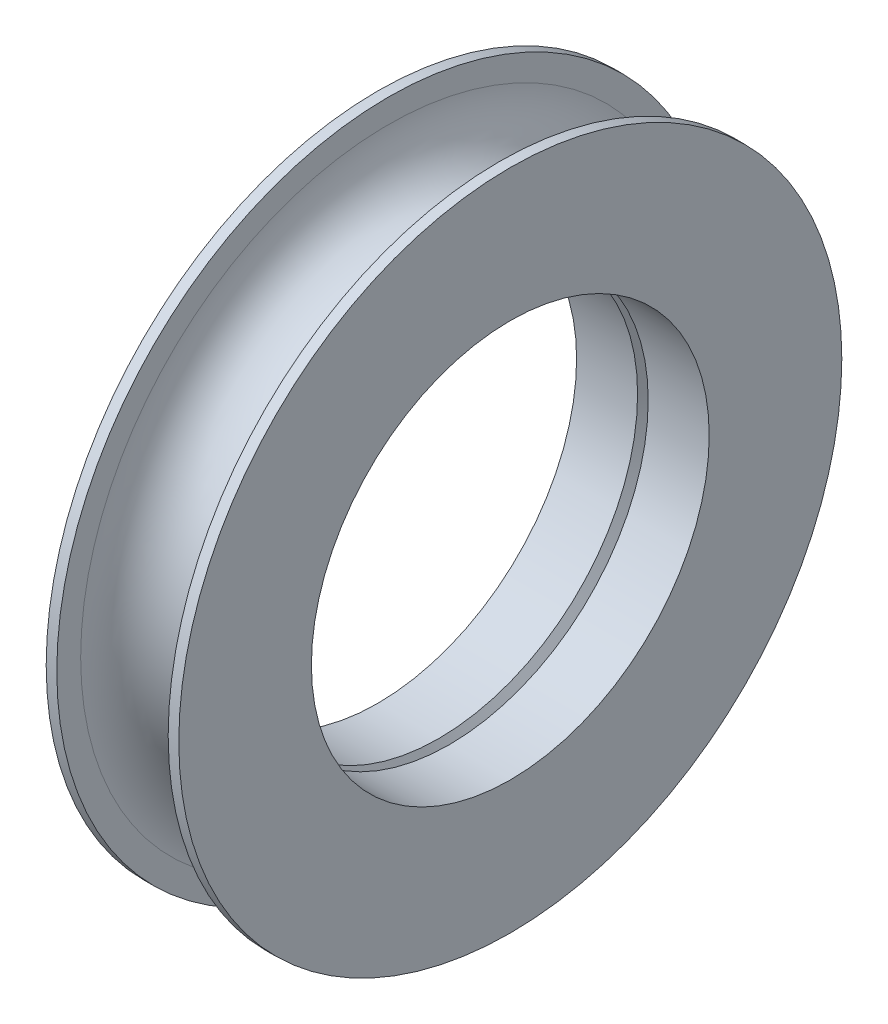
ISO-10303-21;
HEADER;
FILE_DESCRIPTION(('STEP AP214'),'2;1');
FILE_NAME('part.step','',(''),(''),'','','');
FILE_SCHEMA(('AUTOMOTIVE_DESIGN { 1 0 10303 214 1 1 1 1 }'));
ENDSEC;
DATA;
#1=APPLICATION_CONTEXT('core data for automotive mechanical design processes');
#2=APPLICATION_PROTOCOL_DEFINITION('international standard','automotive_design',2000,#1);
#3=PRODUCT_CONTEXT('',#1,'mechanical');
#4=PRODUCT('Part','Part','',(#3));
#5=PRODUCT_RELATED_PRODUCT_CATEGORY('part','',(#4));
#6=PRODUCT_DEFINITION_FORMATION('','',#4);
#7=PRODUCT_DEFINITION_CONTEXT('part definition',#1,'design');
#8=PRODUCT_DEFINITION('design','',#6,#7);
#9=PRODUCT_DEFINITION_SHAPE('','',#8);
#10=(LENGTH_UNIT() NAMED_UNIT(*) SI_UNIT(.MILLI.,.METRE.));
#11=(NAMED_UNIT(*) PLANE_ANGLE_UNIT() SI_UNIT($,.RADIAN.));
#12=(NAMED_UNIT(*) SI_UNIT($,.STERADIAN.) SOLID_ANGLE_UNIT());
#13=UNCERTAINTY_MEASURE_WITH_UNIT(LENGTH_MEASURE(1.E-05),#10,'distance_accuracy_value','');
#14=(GEOMETRIC_REPRESENTATION_CONTEXT(3) GLOBAL_UNCERTAINTY_ASSIGNED_CONTEXT((#13)) GLOBAL_UNIT_ASSIGNED_CONTEXT((#10,
#11,#12)) REPRESENTATION_CONTEXT('',''));
#15=CARTESIAN_POINT('',(0.,0.,0.));
#16=DIRECTION('',(0.,0.,1.));
#17=DIRECTION('',(1.,0.,0.));
#18=AXIS2_PLACEMENT_3D('',#15,#16,#17);
#19=CARTESIAN_POINT('',(-2.5,7.5,0.));
#20=DIRECTION('',(1.,0.,0.));
#21=DIRECTION('',(0.,0.,-1.));
#22=AXIS2_PLACEMENT_3D('',#19,#20,#21);
#23=PLANE('',#22);
#24=CARTESIAN_POINT('',(-2.5,0.,0.));
#25=DIRECTION('',(-1.,0.,0.));
#26=DIRECTION('',(0.,0.,1.));
#27=AXIS2_PLACEMENT_3D('',#24,#25,#26);
#28=CIRCLE('',#27,7.5);
#29=CARTESIAN_POINT('',(-2.5,0.,7.5));
#30=VERTEX_POINT('',#29);
#31=EDGE_CURVE('E10',#30,#30,#28,.T.);
#32=ORIENTED_EDGE('',*,*,#31,.F.);
#33=EDGE_LOOP('',(#32));
#34=FACE_BOUND('',#33,.T.);
#35=CARTESIAN_POINT('',(-2.5,0.,0.));
#36=DIRECTION('',(-1.,0.,0.));
#37=DIRECTION('',(0.,0.,1.));
#38=AXIS2_PLACEMENT_3D('',#35,#36,#37);
#39=CIRCLE('',#38,12.5);
#40=CARTESIAN_POINT('',(-2.5,0.,12.5));
#41=VERTEX_POINT('',#40);
#42=EDGE_CURVE('E67',#41,#41,#39,.T.);
#43=ORIENTED_EDGE('',*,*,#42,.T.);
#44=EDGE_LOOP('',(#43));
#45=FACE_BOUND('',#44,.T.);
#46=ADVANCED_FACE('F30',(#34,#45),#23,.F.);
#47=CARTESIAN_POINT('',(-2.5,0.,0.));
#48=DIRECTION('',(-1.,0.,0.));
#49=DIRECTION('',(0.,0.,1.));
#50=AXIS2_PLACEMENT_3D('',#47,#48,#49);
#51=CYLINDRICAL_SURFACE('',#50,7.5);
#52=CARTESIAN_POINT('',(-0.2,0.,0.));
#53=DIRECTION('',(-1.,0.,0.));
#54=DIRECTION('',(0.,0.,1.));
#55=AXIS2_PLACEMENT_3D('',#52,#53,#54);
#56=CIRCLE('',#55,7.5);
#57=CARTESIAN_POINT('',(-0.2,0.,7.5));
#58=VERTEX_POINT('',#57);
#59=EDGE_CURVE('E36',#58,#58,#56,.T.);
#60=ORIENTED_EDGE('',*,*,#59,.F.);
#61=EDGE_LOOP('',(#60));
#62=FACE_BOUND('',#61,.T.);
#63=ORIENTED_EDGE('',*,*,#31,.T.);
#64=EDGE_LOOP('',(#63));
#65=FACE_BOUND('',#64,.T.);
#66=ADVANCED_FACE('F122',(#62,#65),#51,.F.);
#67=CARTESIAN_POINT('',(-0.2,0.,0.));
#68=DIRECTION('',(1.,0.,0.));
#69=DIRECTION('',(0.,0.,-1.));
#70=AXIS2_PLACEMENT_3D('',#67,#68,#69);
#71=CONICAL_SURFACE('',#70,7.5,1.0471975511966);
#72=CARTESIAN_POINT('',(0.,0.,0.));
#73=DIRECTION('',(-1.,0.,0.));
#74=DIRECTION('',(0.,0.,1.));
#75=AXIS2_PLACEMENT_3D('',#72,#73,#74);
#76=CIRCLE('',#75,7.84641016151378);
#77=CARTESIAN_POINT('',(0.,0.,7.84641016151378));
#78=VERTEX_POINT('',#77);
#79=EDGE_CURVE('E40',#78,#78,#76,.T.);
#80=ORIENTED_EDGE('',*,*,#79,.F.);
#81=EDGE_LOOP('',(#80));
#82=FACE_BOUND('',#81,.T.);
#83=ORIENTED_EDGE('',*,*,#59,.T.);
#84=EDGE_LOOP('',(#83));
#85=FACE_BOUND('',#84,.T.);
#86=ADVANCED_FACE('F117',(#82,#85),#71,.F.);
#87=CARTESIAN_POINT('',(0.,0.,0.));
#88=DIRECTION('',(-1.,0.,0.));
#89=DIRECTION('',(0.,0.,1.));
#90=AXIS2_PLACEMENT_3D('',#87,#88,#89);
#91=CONICAL_SURFACE('',#90,7.84641016151378,1.0471975511966);
#92=CARTESIAN_POINT('',(0.2,0.,0.));
#93=DIRECTION('',(-1.,0.,0.));
#94=DIRECTION('',(0.,0.,1.));
#95=AXIS2_PLACEMENT_3D('',#92,#93,#94);
#96=CIRCLE('',#95,7.5);
#97=CARTESIAN_POINT('',(0.2,0.,7.5));
#98=VERTEX_POINT('',#97);
#99=EDGE_CURVE('E44',#98,#98,#96,.T.);
#100=ORIENTED_EDGE('',*,*,#99,.F.);
#101=EDGE_LOOP('',(#100));
#102=FACE_BOUND('',#101,.T.);
#103=ORIENTED_EDGE('',*,*,#79,.T.);
#104=EDGE_LOOP('',(#103));
#105=FACE_BOUND('',#104,.T.);
#106=ADVANCED_FACE('F111',(#102,#105),#91,.F.);
#107=CARTESIAN_POINT('',(-2.5,0.,0.));
#108=DIRECTION('',(-1.,0.,0.));
#109=DIRECTION('',(0.,0.,1.));
#110=AXIS2_PLACEMENT_3D('',#107,#108,#109);
#111=CYLINDRICAL_SURFACE('',#110,7.5);
#112=CARTESIAN_POINT('',(2.5,0.,0.));
#113=DIRECTION('',(-1.,0.,0.));
#114=DIRECTION('',(0.,0.,1.));
#115=AXIS2_PLACEMENT_3D('',#112,#113,#114);
#116=CIRCLE('',#115,7.5);
#117=CARTESIAN_POINT('',(2.5,0.,7.5));
#118=VERTEX_POINT('',#117);
#119=EDGE_CURVE('E49',#118,#118,#116,.T.);
#120=ORIENTED_EDGE('',*,*,#119,.F.);
#121=EDGE_LOOP('',(#120));
#122=FACE_BOUND('',#121,.T.);
#123=ORIENTED_EDGE('',*,*,#99,.T.);
#124=EDGE_LOOP('',(#123));
#125=FACE_BOUND('',#124,.T.);
#126=ADVANCED_FACE('F105',(#122,#125),#111,.F.);
#127=CARTESIAN_POINT('',(2.5,7.5,0.));
#128=DIRECTION('',(-1.,0.,0.));
#129=DIRECTION('',(0.,0.,1.));
#130=AXIS2_PLACEMENT_3D('',#127,#128,#129);
#131=PLANE('',#130);
#132=CARTESIAN_POINT('',(2.5,0.,0.));
#133=DIRECTION('',(-1.,0.,0.));
#134=DIRECTION('',(0.,0.,1.));
#135=AXIS2_PLACEMENT_3D('',#132,#133,#134);
#136=CIRCLE('',#135,12.5);
#137=CARTESIAN_POINT('',(2.5,0.,12.5));
#138=VERTEX_POINT('',#137);
#139=EDGE_CURVE('E52',#138,#138,#136,.T.);
#140=ORIENTED_EDGE('',*,*,#139,.F.);
#141=EDGE_LOOP('',(#140));
#142=FACE_BOUND('',#141,.T.);
#143=ORIENTED_EDGE('',*,*,#119,.T.);
#144=EDGE_LOOP('',(#143));
#145=FACE_BOUND('',#144,.T.);
#146=ADVANCED_FACE('F99',(#142,#145),#131,.F.);
#147=CARTESIAN_POINT('',(-2.5,0.,0.));
#148=DIRECTION('',(-1.,0.,0.));
#149=DIRECTION('',(0.,0.,1.));
#150=AXIS2_PLACEMENT_3D('',#147,#148,#149);
#151=CYLINDRICAL_SURFACE('',#150,12.5);
#152=CARTESIAN_POINT('',(2.1,0.,0.));
#153=DIRECTION('',(-1.,0.,0.));
#154=DIRECTION('',(0.,0.,1.));
#155=AXIS2_PLACEMENT_3D('',#152,#153,#154);
#156=CIRCLE('',#155,12.5);
#157=CARTESIAN_POINT('',(2.1,0.,12.5));
#158=VERTEX_POINT('',#157);
#159=EDGE_CURVE('E55',#158,#158,#156,.T.);
#160=ORIENTED_EDGE('',*,*,#159,.F.);
#161=EDGE_LOOP('',(#160));
#162=FACE_BOUND('',#161,.T.);
#163=ORIENTED_EDGE('',*,*,#139,.T.);
#164=EDGE_LOOP('',(#163));
#165=FACE_BOUND('',#164,.T.);
#166=ADVANCED_FACE('F93',(#162,#165),#151,.T.);
#167=CARTESIAN_POINT('',(2.1,11.6,0.));
#168=DIRECTION('',(1.,0.,0.));
#169=DIRECTION('',(0.,0.,-1.));
#170=AXIS2_PLACEMENT_3D('',#167,#168,#169);
#171=PLANE('',#170);
#172=CARTESIAN_POINT('',(2.1,0.,0.));
#173=DIRECTION('',(-1.,0.,0.));
#174=DIRECTION('',(0.,0.,1.));
#175=AXIS2_PLACEMENT_3D('',#172,#173,#174);
#176=CIRCLE('',#175,11.6);
#177=CARTESIAN_POINT('',(2.1,0.,11.6));
#178=VERTEX_POINT('',#177);
#179=EDGE_CURVE('E58',#178,#178,#176,.T.);
#180=ORIENTED_EDGE('',*,*,#179,.F.);
#181=EDGE_LOOP('',(#180));
#182=FACE_BOUND('',#181,.T.);
#183=ORIENTED_EDGE('',*,*,#159,.T.);
#184=EDGE_LOOP('',(#183));
#185=FACE_BOUND('',#184,.T.);
#186=ADVANCED_FACE('F87',(#182,#185),#171,.F.);
#187=CARTESIAN_POINT('',(0.,0.,0.));
#188=DIRECTION('',(-1.,0.,0.));
#189=DIRECTION('',(0.,0.,1.));
#190=AXIS2_PLACEMENT_3D('',#187,#188,#189);
#191=TOROIDAL_SURFACE('',#190,11.6,2.1);
#192=CARTESIAN_POINT('',(-2.1,0.,0.));
#193=DIRECTION('',(-1.,0.,0.));
#194=DIRECTION('',(0.,0.,1.));
#195=AXIS2_PLACEMENT_3D('',#192,#193,#194);
#196=CIRCLE('',#195,11.6);
#197=CARTESIAN_POINT('',(-2.1,0.,11.6));
#198=VERTEX_POINT('',#197);
#199=EDGE_CURVE('E61',#198,#198,#196,.T.);
#200=ORIENTED_EDGE('',*,*,#199,.F.);
#201=EDGE_LOOP('',(#200));
#202=FACE_BOUND('',#201,.T.);
#203=ORIENTED_EDGE('',*,*,#179,.T.);
#204=EDGE_LOOP('',(#203));
#205=FACE_BOUND('',#204,.T.);
#206=ADVANCED_FACE('F81',(#202,#205),#191,.F.);
#207=CARTESIAN_POINT('',(-2.1,11.6,0.));
#208=DIRECTION('',(-1.,0.,0.));
#209=DIRECTION('',(0.,0.,1.));
#210=AXIS2_PLACEMENT_3D('',#207,#208,#209);
#211=PLANE('',#210);
#212=CARTESIAN_POINT('',(-2.1,0.,0.));
#213=DIRECTION('',(-1.,0.,0.));
#214=DIRECTION('',(0.,0.,1.));
#215=AXIS2_PLACEMENT_3D('',#212,#213,#214);
#216=CIRCLE('',#215,12.5);
#217=CARTESIAN_POINT('',(-2.1,0.,12.5));
#218=VERTEX_POINT('',#217);
#219=EDGE_CURVE('E64',#218,#218,#216,.T.);
#220=ORIENTED_EDGE('',*,*,#219,.F.);
#221=EDGE_LOOP('',(#220));
#222=FACE_BOUND('',#221,.T.);
#223=ORIENTED_EDGE('',*,*,#199,.T.);
#224=EDGE_LOOP('',(#223));
#225=FACE_BOUND('',#224,.T.);
#226=ADVANCED_FACE('F75',(#222,#225),#211,.F.);
#227=CARTESIAN_POINT('',(-2.5,0.,0.));
#228=DIRECTION('',(-1.,0.,0.));
#229=DIRECTION('',(0.,0.,1.));
#230=AXIS2_PLACEMENT_3D('',#227,#228,#229);
#231=CYLINDRICAL_SURFACE('',#230,12.5);
#232=ORIENTED_EDGE('',*,*,#42,.F.);
#233=EDGE_LOOP('',(#232));
#234=FACE_BOUND('',#233,.T.);
#235=ORIENTED_EDGE('',*,*,#219,.T.);
#236=EDGE_LOOP('',(#235));
#237=FACE_BOUND('',#236,.T.);
#238=ADVANCED_FACE('F72',(#234,#237),#231,.T.);
#239=CLOSED_SHELL('',(#46,#66,#86,#106,#126,#146,#166,#186,#206,#226,#238));
#240=MANIFOLD_SOLID_BREP('B2',#239);
#241=ADVANCED_BREP_SHAPE_REPRESENTATION('',(#18,#240),#14);
#242=SHAPE_DEFINITION_REPRESENTATION(#9,#241);
ENDSEC;
END-ISO-10303-21;
